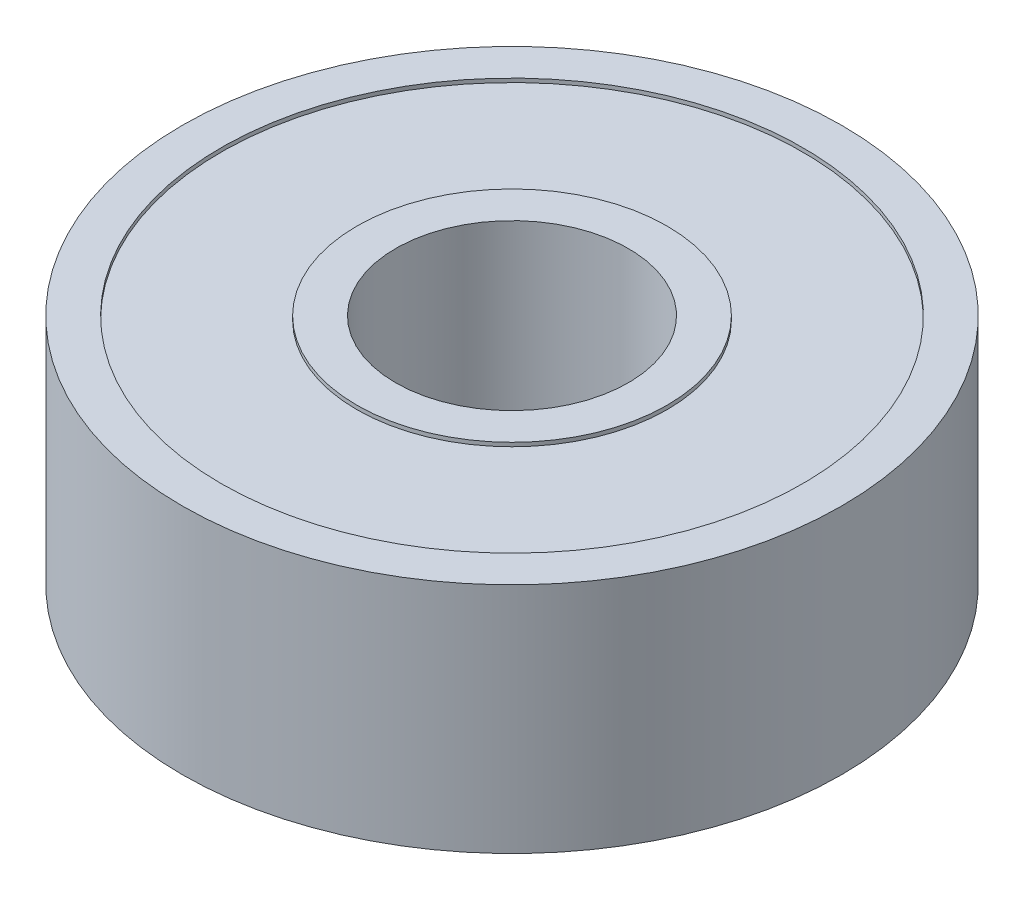
ISO-10303-21;
HEADER;
FILE_DESCRIPTION(('STEP AP214'),'2;1');
FILE_NAME('part.step','',(''),(''),'','','');
FILE_SCHEMA(('AUTOMOTIVE_DESIGN { 1 0 10303 214 1 1 1 1 }'));
ENDSEC;
DATA;
#1=APPLICATION_CONTEXT('core data for automotive mechanical design processes');
#2=APPLICATION_PROTOCOL_DEFINITION('international standard','automotive_design',2000,#1);
#3=PRODUCT_CONTEXT('',#1,'mechanical');
#4=PRODUCT('Part','Part','',(#3));
#5=PRODUCT_RELATED_PRODUCT_CATEGORY('part','',(#4));
#6=PRODUCT_DEFINITION_FORMATION('','',#4);
#7=PRODUCT_DEFINITION_CONTEXT('part definition',#1,'design');
#8=PRODUCT_DEFINITION('design','',#6,#7);
#9=PRODUCT_DEFINITION_SHAPE('','',#8);
#10=(LENGTH_UNIT() NAMED_UNIT(*) SI_UNIT(.MILLI.,.METRE.));
#11=(NAMED_UNIT(*) PLANE_ANGLE_UNIT() SI_UNIT($,.RADIAN.));
#12=(NAMED_UNIT(*) SI_UNIT($,.STERADIAN.) SOLID_ANGLE_UNIT());
#13=UNCERTAINTY_MEASURE_WITH_UNIT(LENGTH_MEASURE(1.E-05),#10,'distance_accuracy_value','');
#14=(GEOMETRIC_REPRESENTATION_CONTEXT(3) GLOBAL_UNCERTAINTY_ASSIGNED_CONTEXT((#13)) GLOBAL_UNIT_ASSIGNED_CONTEXT((#10,
#11,#12)) REPRESENTATION_CONTEXT('',''));
#15=CARTESIAN_POINT('',(0.,0.,0.));
#16=DIRECTION('',(0.,0.,1.));
#17=DIRECTION('',(1.,0.,0.));
#18=AXIS2_PLACEMENT_3D('',#15,#16,#17);
#19=CARTESIAN_POINT('',(0.,0.,0.));
#20=DIRECTION('',(0.,1.,0.));
#21=DIRECTION('',(0.,0.,1.));
#22=AXIS2_PLACEMENT_3D('',#19,#20,#21);
#23=PLANE('',#22);
#24=CARTESIAN_POINT('',(0.,0.,0.));
#25=DIRECTION('',(0.,1.,0.));
#26=DIRECTION('',(0.,0.,1.));
#27=AXIS2_PLACEMENT_3D('',#24,#25,#26);
#28=CIRCLE('',#27,3.);
#29=CARTESIAN_POINT('',(0.,0.,3.));
#30=VERTEX_POINT('',#29);
#31=EDGE_CURVE('E54',#30,#30,#28,.T.);
#32=ORIENTED_EDGE('',*,*,#31,.T.);
#33=EDGE_LOOP('',(#32));
#34=FACE_BOUND('',#33,.T.);
#35=CARTESIAN_POINT('',(0.,0.,0.));
#36=DIRECTION('',(0.,1.,0.));
#37=DIRECTION('',(0.,0.,1.));
#38=AXIS2_PLACEMENT_3D('',#35,#36,#37);
#39=CIRCLE('',#38,4.);
#40=CARTESIAN_POINT('',(0.,0.,4.));
#41=VERTEX_POINT('',#40);
#42=EDGE_CURVE('E86',#41,#41,#39,.T.);
#43=ORIENTED_EDGE('',*,*,#42,.F.);
#44=EDGE_LOOP('',(#43));
#45=FACE_BOUND('',#44,.T.);
#46=ADVANCED_FACE('F39',(#34,#45),#23,.F.);
#47=CARTESIAN_POINT('',(0.,6.,0.));
#48=DIRECTION('',(0.,1.,0.));
#49=DIRECTION('',(0.,0.,1.));
#50=AXIS2_PLACEMENT_3D('',#47,#48,#49);
#51=PLANE('',#50);
#52=CARTESIAN_POINT('',(0.,6.,0.));
#53=DIRECTION('',(0.,1.,0.));
#54=DIRECTION('',(0.,0.,1.));
#55=AXIS2_PLACEMENT_3D('',#52,#53,#54);
#56=CIRCLE('',#55,3.);
#57=CARTESIAN_POINT('',(0.,6.,3.));
#58=VERTEX_POINT('',#57);
#59=EDGE_CURVE('E52',#58,#58,#56,.T.);
#60=ORIENTED_EDGE('',*,*,#59,.F.);
#61=EDGE_LOOP('',(#60));
#62=FACE_BOUND('',#61,.T.);
#63=CARTESIAN_POINT('',(0.,6.,0.));
#64=DIRECTION('',(0.,1.,0.));
#65=DIRECTION('',(0.,0.,1.));
#66=AXIS2_PLACEMENT_3D('',#63,#64,#65);
#67=CIRCLE('',#66,4.);
#68=CARTESIAN_POINT('',(0.,6.,4.));
#69=VERTEX_POINT('',#68);
#70=EDGE_CURVE('E70',#69,#69,#67,.T.);
#71=ORIENTED_EDGE('',*,*,#70,.T.);
#72=EDGE_LOOP('',(#71));
#73=FACE_BOUND('',#72,.T.);
#74=ADVANCED_FACE('F104',(#62,#73),#51,.T.);
#75=CARTESIAN_POINT('',(0.,6.,0.));
#76=DIRECTION('',(0.,1.,0.));
#77=DIRECTION('',(0.,0.,1.));
#78=AXIS2_PLACEMENT_3D('',#75,#76,#77);
#79=CIRCLE('',#78,7.5);
#80=CARTESIAN_POINT('',(0.,6.,7.5));
#81=VERTEX_POINT('',#80);
#82=EDGE_CURVE('E62',#81,#81,#79,.T.);
#83=ORIENTED_EDGE('',*,*,#82,.F.);
#84=EDGE_LOOP('',(#83));
#85=FACE_BOUND('',#84,.T.);
#86=CARTESIAN_POINT('',(0.,6.,0.));
#87=DIRECTION('',(0.,1.,0.));
#88=DIRECTION('',(0.,0.,1.));
#89=AXIS2_PLACEMENT_3D('',#86,#87,#88);
#90=CIRCLE('',#89,8.5);
#91=CARTESIAN_POINT('',(0.,6.,8.5));
#92=VERTEX_POINT('',#91);
#93=EDGE_CURVE('E10',#92,#92,#90,.T.);
#94=ORIENTED_EDGE('',*,*,#93,.T.);
#95=EDGE_LOOP('',(#94));
#96=FACE_BOUND('',#95,.T.);
#97=ADVANCED_FACE('F110',(#85,#96),#51,.T.);
#98=CARTESIAN_POINT('',(0.,0.,0.));
#99=DIRECTION('',(0.,1.,0.));
#100=DIRECTION('',(0.,0.,1.));
#101=AXIS2_PLACEMENT_3D('',#98,#99,#100);
#102=CIRCLE('',#101,7.5);
#103=CARTESIAN_POINT('',(0.,0.,7.5));
#104=VERTEX_POINT('',#103);
#105=EDGE_CURVE('E78',#104,#104,#102,.T.);
#106=ORIENTED_EDGE('',*,*,#105,.T.);
#107=EDGE_LOOP('',(#106));
#108=FACE_BOUND('',#107,.T.);
#109=CARTESIAN_POINT('',(0.,0.,0.));
#110=DIRECTION('',(0.,1.,0.));
#111=DIRECTION('',(0.,0.,1.));
#112=AXIS2_PLACEMENT_3D('',#109,#110,#111);
#113=CIRCLE('',#112,8.5);
#114=CARTESIAN_POINT('',(0.,0.,8.5));
#115=VERTEX_POINT('',#114);
#116=EDGE_CURVE('E43',#115,#115,#113,.T.);
#117=ORIENTED_EDGE('',*,*,#116,.F.);
#118=EDGE_LOOP('',(#117));
#119=FACE_BOUND('',#118,.T.);
#120=ADVANCED_FACE('F106',(#108,#119),#23,.F.);
#121=CARTESIAN_POINT('',(0.,6.,0.));
#122=DIRECTION('',(0.,-1.,0.));
#123=DIRECTION('',(0.,0.,-1.));
#124=AXIS2_PLACEMENT_3D('',#121,#122,#123);
#125=CYLINDRICAL_SURFACE('',#124,8.5);
#126=ORIENTED_EDGE('',*,*,#93,.F.);
#127=EDGE_LOOP('',(#126));
#128=FACE_BOUND('',#127,.T.);
#129=ORIENTED_EDGE('',*,*,#116,.T.);
#130=EDGE_LOOP('',(#129));
#131=FACE_BOUND('',#130,.T.);
#132=ADVANCED_FACE('F41',(#128,#131),#125,.T.);
#133=CARTESIAN_POINT('',(0.,6.,0.));
#134=DIRECTION('',(0.,-1.,0.));
#135=DIRECTION('',(0.,0.,-1.));
#136=AXIS2_PLACEMENT_3D('',#133,#134,#135);
#137=CYLINDRICAL_SURFACE('',#136,3.);
#138=ORIENTED_EDGE('',*,*,#59,.T.);
#139=EDGE_LOOP('',(#138));
#140=FACE_BOUND('',#139,.T.);
#141=ORIENTED_EDGE('',*,*,#31,.F.);
#142=EDGE_LOOP('',(#141));
#143=FACE_BOUND('',#142,.T.);
#144=ADVANCED_FACE('F119',(#140,#143),#137,.F.);
#145=CARTESIAN_POINT('',(0.,5.9,0.));
#146=DIRECTION('',(0.,1.,0.));
#147=DIRECTION('',(0.,0.,1.));
#148=AXIS2_PLACEMENT_3D('',#145,#146,#147);
#149=CYLINDRICAL_SURFACE('',#148,7.5);
#150=CARTESIAN_POINT('',(0.,5.9,0.));
#151=DIRECTION('',(0.,1.,0.));
#152=DIRECTION('',(0.,0.,1.));
#153=AXIS2_PLACEMENT_3D('',#150,#151,#152);
#154=CIRCLE('',#153,7.5);
#155=CARTESIAN_POINT('',(0.,5.9,7.5));
#156=VERTEX_POINT('',#155);
#157=EDGE_CURVE('E58',#156,#156,#154,.T.);
#158=ORIENTED_EDGE('',*,*,#157,.F.);
#159=EDGE_LOOP('',(#158));
#160=FACE_BOUND('',#159,.T.);
#161=ORIENTED_EDGE('',*,*,#82,.T.);
#162=EDGE_LOOP('',(#161));
#163=FACE_BOUND('',#162,.T.);
#164=ADVANCED_FACE('F143',(#160,#163),#149,.F.);
#165=CARTESIAN_POINT('',(0.,5.9,0.));
#166=DIRECTION('',(0.,1.,0.));
#167=DIRECTION('',(0.,0.,1.));
#168=AXIS2_PLACEMENT_3D('',#165,#166,#167);
#169=PLANE('',#168);
#170=CARTESIAN_POINT('',(0.,5.9,0.));
#171=DIRECTION('',(0.,1.,0.));
#172=DIRECTION('',(0.,0.,1.));
#173=AXIS2_PLACEMENT_3D('',#170,#171,#172);
#174=CIRCLE('',#173,4.);
#175=CARTESIAN_POINT('',(0.,5.9,4.));
#176=VERTEX_POINT('',#175);
#177=EDGE_CURVE('E66',#176,#176,#174,.T.);
#178=ORIENTED_EDGE('',*,*,#177,.F.);
#179=EDGE_LOOP('',(#178));
#180=FACE_BOUND('',#179,.T.);
#181=ORIENTED_EDGE('',*,*,#157,.T.);
#182=EDGE_LOOP('',(#181));
#183=FACE_BOUND('',#182,.T.);
#184=ADVANCED_FACE('F139',(#180,#183),#169,.T.);
#185=CARTESIAN_POINT('',(0.,5.9,0.));
#186=DIRECTION('',(0.,1.,0.));
#187=DIRECTION('',(0.,0.,1.));
#188=AXIS2_PLACEMENT_3D('',#185,#186,#187);
#189=CYLINDRICAL_SURFACE('',#188,4.);
#190=ORIENTED_EDGE('',*,*,#177,.T.);
#191=EDGE_LOOP('',(#190));
#192=FACE_BOUND('',#191,.T.);
#193=ORIENTED_EDGE('',*,*,#70,.F.);
#194=EDGE_LOOP('',(#193));
#195=FACE_BOUND('',#194,.T.);
#196=ADVANCED_FACE('F133',(#192,#195),#189,.T.);
#197=CARTESIAN_POINT('',(0.,0.1,0.));
#198=DIRECTION('',(0.,-1.,0.));
#199=DIRECTION('',(0.,0.,1.));
#200=AXIS2_PLACEMENT_3D('',#197,#198,#199);
#201=PLANE('',#200);
#202=CARTESIAN_POINT('',(0.,0.1,0.));
#203=DIRECTION('',(0.,1.,0.));
#204=DIRECTION('',(0.,0.,1.));
#205=AXIS2_PLACEMENT_3D('',#202,#203,#204);
#206=CIRCLE('',#205,7.5);
#207=CARTESIAN_POINT('',(0.,0.1,7.5));
#208=VERTEX_POINT('',#207);
#209=EDGE_CURVE('E74',#208,#208,#206,.T.);
#210=ORIENTED_EDGE('',*,*,#209,.F.);
#211=EDGE_LOOP('',(#210));
#212=FACE_BOUND('',#211,.T.);
#213=CARTESIAN_POINT('',(0.,0.1,0.));
#214=DIRECTION('',(0.,1.,0.));
#215=DIRECTION('',(0.,0.,1.));
#216=AXIS2_PLACEMENT_3D('',#213,#214,#215);
#217=CIRCLE('',#216,4.);
#218=CARTESIAN_POINT('',(0.,0.1,4.));
#219=VERTEX_POINT('',#218);
#220=EDGE_CURVE('E82',#219,#219,#217,.T.);
#221=ORIENTED_EDGE('',*,*,#220,.T.);
#222=EDGE_LOOP('',(#221));
#223=FACE_BOUND('',#222,.T.);
#224=ADVANCED_FACE('F94',(#212,#223),#201,.T.);
#225=CARTESIAN_POINT('',(0.,0.1,0.));
#226=DIRECTION('',(0.,-1.,0.));
#227=DIRECTION('',(0.,0.,-1.));
#228=AXIS2_PLACEMENT_3D('',#225,#226,#227);
#229=CYLINDRICAL_SURFACE('',#228,7.5);
#230=ORIENTED_EDGE('',*,*,#209,.T.);
#231=EDGE_LOOP('',(#230));
#232=FACE_BOUND('',#231,.T.);
#233=ORIENTED_EDGE('',*,*,#105,.F.);
#234=EDGE_LOOP('',(#233));
#235=FACE_BOUND('',#234,.T.);
#236=ADVANCED_FACE('F99',(#232,#235),#229,.F.);
#237=CARTESIAN_POINT('',(0.,0.1,0.));
#238=DIRECTION('',(0.,-1.,0.));
#239=DIRECTION('',(0.,0.,-1.));
#240=AXIS2_PLACEMENT_3D('',#237,#238,#239);
#241=CYLINDRICAL_SURFACE('',#240,4.);
#242=ORIENTED_EDGE('',*,*,#220,.F.);
#243=EDGE_LOOP('',(#242));
#244=FACE_BOUND('',#243,.T.);
#245=ORIENTED_EDGE('',*,*,#42,.T.);
#246=EDGE_LOOP('',(#245));
#247=FACE_BOUND('',#246,.T.);
#248=ADVANCED_FACE('F96',(#244,#247),#241,.T.);
#249=CLOSED_SHELL('',(#46,#74,#97,#120,#132,#144,#164,#184,#196,#224,#236,#248));
#250=MANIFOLD_SOLID_BREP('B2',#249);
#251=ADVANCED_BREP_SHAPE_REPRESENTATION('',(#18,#250),#14);
#252=SHAPE_DEFINITION_REPRESENTATION(#9,#251);
ENDSEC;
END-ISO-10303-21;
